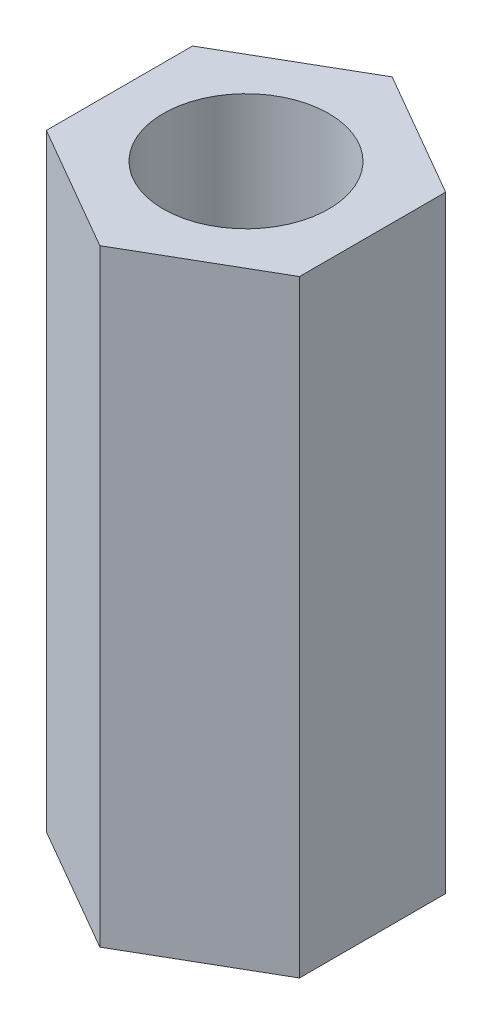
ISO-10303-21;
HEADER;
FILE_DESCRIPTION(('STEP AP214'),'2;1');
FILE_NAME('part.step','',(''),(''),'','','');
FILE_SCHEMA(('AUTOMOTIVE_DESIGN { 1 0 10303 214 1 1 1 1 }'));
ENDSEC;
DATA;
#1=APPLICATION_CONTEXT('core data for automotive mechanical design processes');
#2=APPLICATION_PROTOCOL_DEFINITION('international standard','automotive_design',2000,#1);
#3=PRODUCT_CONTEXT('',#1,'mechanical');
#4=PRODUCT('Part','Part','',(#3));
#5=PRODUCT_RELATED_PRODUCT_CATEGORY('part','',(#4));
#6=PRODUCT_DEFINITION_FORMATION('','',#4);
#7=PRODUCT_DEFINITION_CONTEXT('part definition',#1,'design');
#8=PRODUCT_DEFINITION('design','',#6,#7);
#9=PRODUCT_DEFINITION_SHAPE('','',#8);
#10=(LENGTH_UNIT() NAMED_UNIT(*) SI_UNIT(.MILLI.,.METRE.));
#11=(NAMED_UNIT(*) PLANE_ANGLE_UNIT() SI_UNIT($,.RADIAN.));
#12=(NAMED_UNIT(*) SI_UNIT($,.STERADIAN.) SOLID_ANGLE_UNIT());
#13=UNCERTAINTY_MEASURE_WITH_UNIT(LENGTH_MEASURE(1.E-05),#10,'distance_accuracy_value','');
#14=(GEOMETRIC_REPRESENTATION_CONTEXT(3) GLOBAL_UNCERTAINTY_ASSIGNED_CONTEXT((#13)) GLOBAL_UNIT_ASSIGNED_CONTEXT((#10,
#11,#12)) REPRESENTATION_CONTEXT('',''));
#15=CARTESIAN_POINT('',(0.,0.,0.));
#16=DIRECTION('',(0.,0.,1.));
#17=DIRECTION('',(1.,0.,0.));
#18=AXIS2_PLACEMENT_3D('',#15,#16,#17);
#19=CARTESIAN_POINT('',(0.,12.,0.));
#20=DIRECTION('',(0.,-1.,0.));
#21=DIRECTION('',(0.,0.,-1.));
#22=AXIS2_PLACEMENT_3D('',#19,#20,#21);
#23=PLANE('',#22);
#24=DIRECTION('',(-0.86602542888642,0.,-0.49999995652209));
#25=VECTOR('',#24,1.);
#26=CARTESIAN_POINT('',(-1.44938846189692E-07,12.,-2.887));
#27=LINE('',#26,#25);
#28=CARTESIAN_POINT('',(2.50021526825625,12.,-1.44350012552072));
#29=VERTEX_POINT('',#28);
#30=CARTESIAN_POINT('',(-1.44938846189692E-07,12.,-2.887));
#31=VERTEX_POINT('',#30);
#32=EDGE_CURVE('E131',#29,#31,#27,.T.);
#33=ORIENTED_EDGE('',*,*,#32,.T.);
#34=DIRECTION('',(-0.866025378682455,0.,0.500000043477908));
#35=VECTOR('',#34,1.);
#36=CARTESIAN_POINT('',(-2.50021541319509,12.,-1.44349987447928));
#37=LINE('',#36,#35);
#38=CARTESIAN_POINT('',(-2.50021541319509,12.,-1.44349987447928));
#39=VERTEX_POINT('',#38);
#40=EDGE_CURVE('E89',#31,#39,#37,.T.);
#41=ORIENTED_EDGE('',*,*,#40,.T.);
#42=DIRECTION('',(5.02039646973577E-08,0.,0.999999999999999));
#43=VECTOR('',#42,1.);
#44=CARTESIAN_POINT('',(-2.50021526825625,12.,1.44350012552072));
#45=LINE('',#44,#43);
#46=CARTESIAN_POINT('',(-2.50021526825625,12.,1.44350012552072));
#47=VERTEX_POINT('',#46);
#48=EDGE_CURVE('E102',#39,#47,#45,.T.);
#49=ORIENTED_EDGE('',*,*,#48,.T.);
#50=DIRECTION('',(0.86602542888642,0.,0.49999995652209));
#51=VECTOR('',#50,1.);
#52=CARTESIAN_POINT('',(1.44938846487848E-07,12.,2.887));
#53=LINE('',#52,#51);
#54=CARTESIAN_POINT('',(1.44938846487848E-07,12.,2.887));
#55=VERTEX_POINT('',#54);
#56=EDGE_CURVE('E96',#47,#55,#53,.T.);
#57=ORIENTED_EDGE('',*,*,#56,.T.);
#58=DIRECTION('',(0.866025378682455,0.,-0.500000043477908));
#59=VECTOR('',#58,1.);
#60=CARTESIAN_POINT('',(2.50021541319509,12.,1.44349987447928));
#61=LINE('',#60,#59);
#62=CARTESIAN_POINT('',(2.50021541319509,12.,1.44349987447928));
#63=VERTEX_POINT('',#62);
#64=EDGE_CURVE('E100',#55,#63,#61,.T.);
#65=ORIENTED_EDGE('',*,*,#64,.T.);
#66=DIRECTION('',(-5.02039645471391E-08,0.,-0.999999999999999));
#67=VECTOR('',#66,1.);
#68=CARTESIAN_POINT('',(2.50021526825625,12.,-1.44350012552072));
#69=LINE('',#68,#67);
#70=EDGE_CURVE('E52',#63,#29,#69,.T.);
#71=ORIENTED_EDGE('',*,*,#70,.T.);
#72=EDGE_LOOP('',(#33,#41,#49,#57,#65,#71));
#73=FACE_BOUND('',#72,.T.);
#74=CARTESIAN_POINT('',(0.,12.,0.));
#75=DIRECTION('',(0.,1.,0.));
#76=DIRECTION('',(0.,0.,1.));
#77=AXIS2_PLACEMENT_3D('',#74,#75,#76);
#78=CIRCLE('',#77,1.635);
#79=CARTESIAN_POINT('',(0.,12.,1.635));
#80=VERTEX_POINT('',#79);
#81=EDGE_CURVE('E124',#80,#80,#78,.T.);
#82=ORIENTED_EDGE('',*,*,#81,.F.);
#83=EDGE_LOOP('',(#82));
#84=FACE_BOUND('',#83,.T.);
#85=ADVANCED_FACE('F35',(#73,#84),#23,.F.);
#86=CARTESIAN_POINT('',(0.,0.,0.));
#87=DIRECTION('',(0.,-1.,0.));
#88=DIRECTION('',(0.,0.,-1.));
#89=AXIS2_PLACEMENT_3D('',#86,#87,#88);
#90=PLANE('',#89);
#91=DIRECTION('',(-0.86602542888642,0.,-0.49999995652209));
#92=VECTOR('',#91,1.);
#93=CARTESIAN_POINT('',(-1.44938846189692E-07,0.,-2.887));
#94=LINE('',#93,#92);
#95=CARTESIAN_POINT('',(2.50021526825625,0.,-1.44350012552072));
#96=VERTEX_POINT('',#95);
#97=CARTESIAN_POINT('',(-1.44938846189692E-07,0.,-2.887));
#98=VERTEX_POINT('',#97);
#99=EDGE_CURVE('E120',#96,#98,#94,.T.);
#100=ORIENTED_EDGE('',*,*,#99,.F.);
#101=DIRECTION('',(-5.02039645471391E-08,0.,-0.999999999999999));
#102=VECTOR('',#101,1.);
#103=CARTESIAN_POINT('',(2.50021526825625,0.,-1.44350012552072));
#104=LINE('',#103,#102);
#105=CARTESIAN_POINT('',(2.50021541319509,0.,1.44349987447928));
#106=VERTEX_POINT('',#105);
#107=EDGE_CURVE('E81',#106,#96,#104,.T.);
#108=ORIENTED_EDGE('',*,*,#107,.F.);
#109=DIRECTION('',(0.866025378682455,0.,-0.500000043477908));
#110=VECTOR('',#109,1.);
#111=CARTESIAN_POINT('',(2.50021541319509,0.,1.44349987447928));
#112=LINE('',#111,#110);
#113=CARTESIAN_POINT('',(1.44938846487848E-07,0.,2.887));
#114=VERTEX_POINT('',#113);
#115=EDGE_CURVE('E75',#114,#106,#112,.T.);
#116=ORIENTED_EDGE('',*,*,#115,.F.);
#117=DIRECTION('',(0.86602542888642,0.,0.49999995652209));
#118=VECTOR('',#117,1.);
#119=CARTESIAN_POINT('',(1.44938846487848E-07,0.,2.887));
#120=LINE('',#119,#118);
#121=CARTESIAN_POINT('',(-2.50021526825625,0.,1.44350012552072));
#122=VERTEX_POINT('',#121);
#123=EDGE_CURVE('E110',#122,#114,#120,.T.);
#124=ORIENTED_EDGE('',*,*,#123,.F.);
#125=DIRECTION('',(5.02039646973577E-08,0.,0.999999999999999));
#126=VECTOR('',#125,1.);
#127=CARTESIAN_POINT('',(-2.50021526825625,0.,1.44350012552072));
#128=LINE('',#127,#126);
#129=CARTESIAN_POINT('',(-2.50021541319509,0.,-1.44349987447928));
#130=VERTEX_POINT('',#129);
#131=EDGE_CURVE('E126',#130,#122,#128,.T.);
#132=ORIENTED_EDGE('',*,*,#131,.F.);
#133=DIRECTION('',(-0.866025378682455,0.,0.500000043477908));
#134=VECTOR('',#133,1.);
#135=CARTESIAN_POINT('',(-2.50021541319509,0.,-1.44349987447928));
#136=LINE('',#135,#134);
#137=EDGE_CURVE('E123',#98,#130,#136,.T.);
#138=ORIENTED_EDGE('',*,*,#137,.F.);
#139=EDGE_LOOP('',(#100,#108,#116,#124,#132,#138));
#140=FACE_BOUND('',#139,.T.);
#141=CARTESIAN_POINT('',(0.,0.,0.));
#142=DIRECTION('',(0.,1.,0.));
#143=DIRECTION('',(0.,0.,1.));
#144=AXIS2_PLACEMENT_3D('',#141,#142,#143);
#145=CIRCLE('',#144,1.635);
#146=CARTESIAN_POINT('',(0.,0.,1.635));
#147=VERTEX_POINT('',#146);
#148=EDGE_CURVE('E224',#147,#147,#145,.T.);
#149=ORIENTED_EDGE('',*,*,#148,.T.);
#150=EDGE_LOOP('',(#149));
#151=FACE_BOUND('',#150,.T.);
#152=ADVANCED_FACE('F140',(#140,#151),#90,.T.);
#153=CARTESIAN_POINT('',(-1.44938846189692E-07,12.,-2.887));
#154=DIRECTION('',(-0.49999995652209,0.,0.86602542888642));
#155=DIRECTION('',(0.86602542888642,0.,0.49999995652209));
#156=AXIS2_PLACEMENT_3D('',#153,#154,#155);
#157=PLANE('',#156);
#158=ORIENTED_EDGE('',*,*,#99,.T.);
#159=DIRECTION('',(0.,-1.,0.));
#160=VECTOR('',#159,1.);
#161=CARTESIAN_POINT('',(-1.44938846189692E-07,12.,-2.887));
#162=LINE('',#161,#160);
#163=EDGE_CURVE('E11',#31,#98,#162,.T.);
#164=ORIENTED_EDGE('',*,*,#163,.F.);
#165=ORIENTED_EDGE('',*,*,#32,.F.);
#166=DIRECTION('',(0.,-1.,0.));
#167=VECTOR('',#166,1.);
#168=CARTESIAN_POINT('',(2.50021526825625,12.,-1.44350012552072));
#169=LINE('',#168,#167);
#170=EDGE_CURVE('E116',#29,#96,#169,.T.);
#171=ORIENTED_EDGE('',*,*,#170,.T.);
#172=EDGE_LOOP('',(#158,#164,#165,#171));
#173=FACE_BOUND('',#172,.T.);
#174=ADVANCED_FACE('F37',(#173),#157,.F.);
#175=CARTESIAN_POINT('',(-2.50021541319509,12.,-1.44349987447928));
#176=DIRECTION('',(0.500000043477908,0.,0.866025378682455));
#177=DIRECTION('',(0.866025378682455,0.,-0.500000043477908));
#178=AXIS2_PLACEMENT_3D('',#175,#176,#177);
#179=PLANE('',#178);
#180=ORIENTED_EDGE('',*,*,#137,.T.);
#181=DIRECTION('',(0.,-1.,0.));
#182=VECTOR('',#181,1.);
#183=CARTESIAN_POINT('',(-2.50021541319509,12.,-1.44349987447928));
#184=LINE('',#183,#182);
#185=EDGE_CURVE('E44',#39,#130,#184,.T.);
#186=ORIENTED_EDGE('',*,*,#185,.F.);
#187=ORIENTED_EDGE('',*,*,#40,.F.);
#188=ORIENTED_EDGE('',*,*,#163,.T.);
#189=EDGE_LOOP('',(#180,#186,#187,#188));
#190=FACE_BOUND('',#189,.T.);
#191=ADVANCED_FACE('F165',(#190),#179,.F.);
#192=CARTESIAN_POINT('',(-2.50021526825625,12.,1.44350012552072));
#193=DIRECTION('',(0.999999999999999,0.,-5.02039646973576E-08));
#194=DIRECTION('',(-5.02039646973577E-08,0.,-0.999999999999999));
#195=AXIS2_PLACEMENT_3D('',#192,#193,#194);
#196=PLANE('',#195);
#197=ORIENTED_EDGE('',*,*,#131,.T.);
#198=DIRECTION('',(0.,-1.,0.));
#199=VECTOR('',#198,1.);
#200=CARTESIAN_POINT('',(-2.50021526825625,12.,1.44350012552072));
#201=LINE('',#200,#199);
#202=EDGE_CURVE('E111',#47,#122,#201,.T.);
#203=ORIENTED_EDGE('',*,*,#202,.F.);
#204=ORIENTED_EDGE('',*,*,#48,.F.);
#205=ORIENTED_EDGE('',*,*,#185,.T.);
#206=EDGE_LOOP('',(#197,#203,#204,#205));
#207=FACE_BOUND('',#206,.T.);
#208=ADVANCED_FACE('F137',(#207),#196,.F.);
#209=CARTESIAN_POINT('',(1.44938846487848E-07,12.,2.887));
#210=DIRECTION('',(0.49999995652209,0.,-0.86602542888642));
#211=DIRECTION('',(-0.86602542888642,0.,-0.49999995652209));
#212=AXIS2_PLACEMENT_3D('',#209,#210,#211);
#213=PLANE('',#212);
#214=ORIENTED_EDGE('',*,*,#123,.T.);
#215=DIRECTION('',(0.,-1.,0.));
#216=VECTOR('',#215,1.);
#217=CARTESIAN_POINT('',(1.44938846487848E-07,12.,2.887));
#218=LINE('',#217,#216);
#219=EDGE_CURVE('E107',#55,#114,#218,.T.);
#220=ORIENTED_EDGE('',*,*,#219,.F.);
#221=ORIENTED_EDGE('',*,*,#56,.F.);
#222=ORIENTED_EDGE('',*,*,#202,.T.);
#223=EDGE_LOOP('',(#214,#220,#221,#222));
#224=FACE_BOUND('',#223,.T.);
#225=ADVANCED_FACE('F108',(#224),#213,.F.);
#226=CARTESIAN_POINT('',(2.50021541319509,12.,1.44349987447928));
#227=DIRECTION('',(-0.500000043477908,0.,-0.866025378682455));
#228=DIRECTION('',(-0.866025378682455,0.,0.500000043477908));
#229=AXIS2_PLACEMENT_3D('',#226,#227,#228);
#230=PLANE('',#229);
#231=ORIENTED_EDGE('',*,*,#115,.T.);
#232=DIRECTION('',(0.,-1.,0.));
#233=VECTOR('',#232,1.);
#234=CARTESIAN_POINT('',(2.50021541319509,12.,1.44349987447928));
#235=LINE('',#234,#233);
#236=EDGE_CURVE('E112',#63,#106,#235,.T.);
#237=ORIENTED_EDGE('',*,*,#236,.F.);
#238=ORIENTED_EDGE('',*,*,#64,.F.);
#239=ORIENTED_EDGE('',*,*,#219,.T.);
#240=EDGE_LOOP('',(#231,#237,#238,#239));
#241=FACE_BOUND('',#240,.T.);
#242=ADVANCED_FACE('F114',(#241),#230,.F.);
#243=CARTESIAN_POINT('',(2.50021526825625,12.,-1.44350012552072));
#244=DIRECTION('',(-0.999999999999999,0.,5.02039645471391E-08));
#245=DIRECTION('',(5.02039645471391E-08,0.,0.999999999999999));
#246=AXIS2_PLACEMENT_3D('',#243,#244,#245);
#247=PLANE('',#246);
#248=ORIENTED_EDGE('',*,*,#107,.T.);
#249=ORIENTED_EDGE('',*,*,#170,.F.);
#250=ORIENTED_EDGE('',*,*,#70,.F.);
#251=ORIENTED_EDGE('',*,*,#236,.T.);
#252=EDGE_LOOP('',(#248,#249,#250,#251));
#253=FACE_BOUND('',#252,.T.);
#254=ADVANCED_FACE('F145',(#253),#247,.F.);
#255=CARTESIAN_POINT('',(0.,12.,0.));
#256=DIRECTION('',(0.,-1.,0.));
#257=DIRECTION('',(0.,0.,-1.));
#258=AXIS2_PLACEMENT_3D('',#255,#256,#257);
#259=CYLINDRICAL_SURFACE('',#258,1.635);
#260=ORIENTED_EDGE('',*,*,#81,.T.);
#261=EDGE_LOOP('',(#260));
#262=FACE_BOUND('',#261,.T.);
#263=ORIENTED_EDGE('',*,*,#148,.F.);
#264=EDGE_LOOP('',(#263));
#265=FACE_BOUND('',#264,.T.);
#266=ADVANCED_FACE('F147',(#262,#265),#259,.F.);
#267=CLOSED_SHELL('',(#85,#152,#174,#191,#208,#225,#242,#254,#266));
#268=MANIFOLD_SOLID_BREP('B2',#267);
#269=ADVANCED_BREP_SHAPE_REPRESENTATION('',(#18,#268),#14);
#270=SHAPE_DEFINITION_REPRESENTATION(#9,#269);
ENDSEC;
END-ISO-10303-21;
